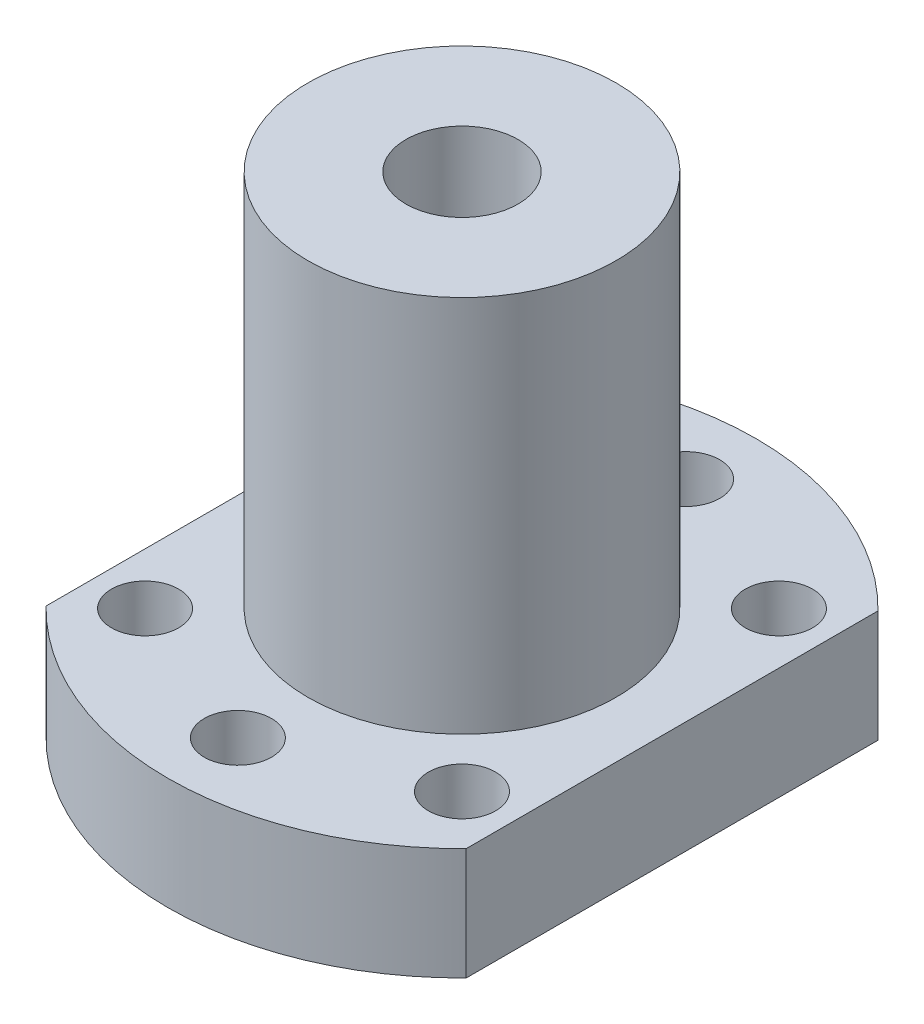
ISO-10303-21;
HEADER;
FILE_DESCRIPTION(('STEP AP214'),'2;1');
FILE_NAME('part.step','',(''),(''),'','','');
FILE_SCHEMA(('AUTOMOTIVE_DESIGN { 1 0 10303 214 1 1 1 1 }'));
ENDSEC;
DATA;
#1=APPLICATION_CONTEXT('core data for automotive mechanical design processes');
#2=APPLICATION_PROTOCOL_DEFINITION('international standard','automotive_design',2000,#1);
#3=PRODUCT_CONTEXT('',#1,'mechanical');
#4=PRODUCT('Part','Part','',(#3));
#5=PRODUCT_RELATED_PRODUCT_CATEGORY('part','',(#4));
#6=PRODUCT_DEFINITION_FORMATION('','',#4);
#7=PRODUCT_DEFINITION_CONTEXT('part definition',#1,'design');
#8=PRODUCT_DEFINITION('design','',#6,#7);
#9=PRODUCT_DEFINITION_SHAPE('','',#8);
#10=(LENGTH_UNIT() NAMED_UNIT(*) SI_UNIT(.MILLI.,.METRE.));
#11=(NAMED_UNIT(*) PLANE_ANGLE_UNIT() SI_UNIT($,.RADIAN.));
#12=(NAMED_UNIT(*) SI_UNIT($,.STERADIAN.) SOLID_ANGLE_UNIT());
#13=UNCERTAINTY_MEASURE_WITH_UNIT(LENGTH_MEASURE(1.E-05),#10,'distance_accuracy_value','');
#14=(GEOMETRIC_REPRESENTATION_CONTEXT(3) GLOBAL_UNCERTAINTY_ASSIGNED_CONTEXT((#13)) GLOBAL_UNIT_ASSIGNED_CONTEXT((#10,
#11,#12)) REPRESENTATION_CONTEXT('',''));
#15=CARTESIAN_POINT('',(0.,0.,0.));
#16=DIRECTION('',(0.,0.,1.));
#17=DIRECTION('',(1.,0.,0.));
#18=AXIS2_PLACEMENT_3D('',#15,#16,#17);
#19=CARTESIAN_POINT('',(0.,8.,0.));
#20=DIRECTION('',(0.,1.,0.));
#21=DIRECTION('',(0.,0.,1.));
#22=AXIS2_PLACEMENT_3D('',#19,#20,#21);
#23=PLANE('',#22);
#24=CARTESIAN_POINT('',(0.,8.,0.));
#25=DIRECTION('',(0.,1.,0.));
#26=DIRECTION('',(0.,0.,1.));
#27=AXIS2_PLACEMENT_3D('',#24,#25,#26);
#28=CIRCLE('',#27,21.);
#29=CARTESIAN_POINT('',(15.,8.,-14.6969384566991));
#30=VERTEX_POINT('',#29);
#31=CARTESIAN_POINT('',(-15.,8.,-14.6969384566991));
#32=VERTEX_POINT('',#31);
#33=EDGE_CURVE('E87',#30,#32,#28,.T.);
#34=ORIENTED_EDGE('',*,*,#33,.T.);
#35=DIRECTION('',(0.,0.,1.));
#36=VECTOR('',#35,1.);
#37=CARTESIAN_POINT('',(-15.,8.,-14.6969384566991));
#38=LINE('',#37,#36);
#39=CARTESIAN_POINT('',(-15.,8.,14.6969384566991));
#40=VERTEX_POINT('',#39);
#41=EDGE_CURVE('E82',#32,#40,#38,.T.);
#42=ORIENTED_EDGE('',*,*,#41,.T.);
#43=CARTESIAN_POINT('',(0.,8.,0.));
#44=DIRECTION('',(0.,1.,0.));
#45=DIRECTION('',(0.,0.,1.));
#46=AXIS2_PLACEMENT_3D('',#43,#44,#45);
#47=CIRCLE('',#46,21.);
#48=CARTESIAN_POINT('',(15.,8.,14.6969384566991));
#49=VERTEX_POINT('',#48);
#50=EDGE_CURVE('E85',#40,#49,#47,.T.);
#51=ORIENTED_EDGE('',*,*,#50,.T.);
#52=DIRECTION('',(0.,0.,-1.));
#53=VECTOR('',#52,1.);
#54=CARTESIAN_POINT('',(15.,8.,-14.6969384566991));
#55=LINE('',#54,#53);
#56=EDGE_CURVE('E52',#49,#30,#55,.T.);
#57=ORIENTED_EDGE('',*,*,#56,.T.);
#58=EDGE_LOOP('',(#34,#42,#51,#57));
#59=FACE_BOUND('',#58,.T.);
#60=CARTESIAN_POINT('',(-11.3137084989848,8.,-11.3137084989847));
#61=DIRECTION('',(0.,1.,0.));
#62=DIRECTION('',(0.,0.,1.));
#63=AXIS2_PLACEMENT_3D('',#60,#61,#62);
#64=CIRCLE('',#63,2.4);
#65=CARTESIAN_POINT('',(-11.3137084989848,8.,-8.9137084989847));
#66=VERTEX_POINT('',#65);
#67=EDGE_CURVE('E116',#66,#66,#64,.T.);
#68=ORIENTED_EDGE('',*,*,#67,.F.);
#69=EDGE_LOOP('',(#68));
#70=FACE_BOUND('',#69,.T.);
#71=CARTESIAN_POINT('',(-11.3137084989847,8.,11.3137084989849));
#72=DIRECTION('',(0.,1.,0.));
#73=DIRECTION('',(1.,0.,0.));
#74=AXIS2_PLACEMENT_3D('',#71,#72,#73);
#75=CIRCLE('',#74,2.4);
#76=CARTESIAN_POINT('',(-8.91370849898466,8.,11.3137084989848));
#77=VERTEX_POINT('',#76);
#78=EDGE_CURVE('E122',#77,#77,#75,.T.);
#79=ORIENTED_EDGE('',*,*,#78,.F.);
#80=EDGE_LOOP('',(#79));
#81=FACE_BOUND('',#80,.T.);
#82=CARTESIAN_POINT('',(1.6826817716975E-13,8.,16.));
#83=DIRECTION('',(0.,1.,0.));
#84=DIRECTION('',(0.707106781186544,0.,-0.707106781186551));
#85=AXIS2_PLACEMENT_3D('',#82,#83,#84);
#86=CIRCLE('',#85,2.4);
#87=CARTESIAN_POINT('',(1.69705627484787,8.,14.3029437251523));
#88=VERTEX_POINT('',#87);
#89=EDGE_CURVE('E128',#88,#88,#86,.T.);
#90=ORIENTED_EDGE('',*,*,#89,.F.);
#91=EDGE_LOOP('',(#90));
#92=FACE_BOUND('',#91,.T.);
#93=CARTESIAN_POINT('',(11.3137084989848,8.,11.3137084989847));
#94=DIRECTION('',(0.,1.,0.));
#95=DIRECTION('',(0.,0.,-1.));
#96=AXIS2_PLACEMENT_3D('',#93,#94,#95);
#97=CIRCLE('',#96,2.4);
#98=CARTESIAN_POINT('',(11.3137084989848,8.,8.9137084989847));
#99=VERTEX_POINT('',#98);
#100=EDGE_CURVE('E134',#99,#99,#97,.T.);
#101=ORIENTED_EDGE('',*,*,#100,.F.);
#102=EDGE_LOOP('',(#101));
#103=FACE_BOUND('',#102,.T.);
#104=CARTESIAN_POINT('',(11.3137084989846,8.,-11.3137084989849));
#105=DIRECTION('',(0.,1.,0.));
#106=DIRECTION('',(-1.,0.,0.));
#107=AXIS2_PLACEMENT_3D('',#104,#105,#106);
#108=CIRCLE('',#107,2.4);
#109=CARTESIAN_POINT('',(8.91370849898458,8.,-11.3137084989849));
#110=VERTEX_POINT('',#109);
#111=EDGE_CURVE('E140',#110,#110,#108,.T.);
#112=ORIENTED_EDGE('',*,*,#111,.F.);
#113=EDGE_LOOP('',(#112));
#114=FACE_BOUND('',#113,.T.);
#115=CARTESIAN_POINT('',(-2.79290479632266E-13,8.,-16.));
#116=DIRECTION('',(0.,1.,0.));
#117=DIRECTION('',(-0.707106781186539,0.,0.707106781186556));
#118=AXIS2_PLACEMENT_3D('',#115,#116,#117);
#119=CIRCLE('',#118,2.4);
#120=CARTESIAN_POINT('',(-1.69705627484797,8.,-14.3029437251523));
#121=VERTEX_POINT('',#120);
#122=EDGE_CURVE('E146',#121,#121,#119,.T.);
#123=ORIENTED_EDGE('',*,*,#122,.F.);
#124=EDGE_LOOP('',(#123));
#125=FACE_BOUND('',#124,.T.);
#126=CARTESIAN_POINT('',(0.,8.,0.));
#127=DIRECTION('',(0.,1.,0.));
#128=DIRECTION('',(0.,0.,1.));
#129=AXIS2_PLACEMENT_3D('',#126,#127,#128);
#130=CIRCLE('',#129,11.);
#131=CARTESIAN_POINT('',(0.,8.,11.));
#132=VERTEX_POINT('',#131);
#133=EDGE_CURVE('E152',#132,#132,#130,.T.);
#134=ORIENTED_EDGE('',*,*,#133,.F.);
#135=EDGE_LOOP('',(#134));
#136=FACE_BOUND('',#135,.T.);
#137=ADVANCED_FACE('F35',(#59,#70,#81,#92,#103,#114,#125,#136),#23,.T.);
#138=CARTESIAN_POINT('',(0.,8.,0.));
#139=DIRECTION('',(0.,-1.,0.));
#140=DIRECTION('',(0.,0.,-1.));
#141=AXIS2_PLACEMENT_3D('',#138,#139,#140);
#142=CYLINDRICAL_SURFACE('',#141,21.);
#143=CARTESIAN_POINT('',(0.,0.,0.));
#144=DIRECTION('',(0.,1.,0.));
#145=DIRECTION('',(0.,0.,1.));
#146=AXIS2_PLACEMENT_3D('',#143,#144,#145);
#147=CIRCLE('',#146,21.);
#148=CARTESIAN_POINT('',(15.,0.,-14.6969384566991));
#149=VERTEX_POINT('',#148);
#150=CARTESIAN_POINT('',(-15.,0.,-14.6969384566991));
#151=VERTEX_POINT('',#150);
#152=EDGE_CURVE('E99',#149,#151,#147,.T.);
#153=ORIENTED_EDGE('',*,*,#152,.T.);
#154=DIRECTION('',(0.,-1.,0.));
#155=VECTOR('',#154,1.);
#156=CARTESIAN_POINT('',(-15.,8.,-14.6969384566991));
#157=LINE('',#156,#155);
#158=EDGE_CURVE('E11',#32,#151,#157,.T.);
#159=ORIENTED_EDGE('',*,*,#158,.F.);
#160=ORIENTED_EDGE('',*,*,#33,.F.);
#161=DIRECTION('',(0.,-1.,0.));
#162=VECTOR('',#161,1.);
#163=CARTESIAN_POINT('',(15.,8.,-14.6969384566991));
#164=LINE('',#163,#162);
#165=EDGE_CURVE('E95',#30,#149,#164,.T.);
#166=ORIENTED_EDGE('',*,*,#165,.T.);
#167=EDGE_LOOP('',(#153,#159,#160,#166));
#168=FACE_BOUND('',#167,.T.);
#169=ADVANCED_FACE('F37',(#168),#142,.T.);
#170=CARTESIAN_POINT('',(-15.,8.,-14.6969384566991));
#171=DIRECTION('',(1.,0.,0.));
#172=DIRECTION('',(0.,0.,-1.));
#173=AXIS2_PLACEMENT_3D('',#170,#171,#172);
#174=PLANE('',#173);
#175=DIRECTION('',(0.,0.,1.));
#176=VECTOR('',#175,1.);
#177=CARTESIAN_POINT('',(-15.,0.,-14.6969384566991));
#178=LINE('',#177,#176);
#179=CARTESIAN_POINT('',(-15.,0.,14.6969384566991));
#180=VERTEX_POINT('',#179);
#181=EDGE_CURVE('E91',#151,#180,#178,.T.);
#182=ORIENTED_EDGE('',*,*,#181,.T.);
#183=DIRECTION('',(0.,-1.,0.));
#184=VECTOR('',#183,1.);
#185=CARTESIAN_POINT('',(-15.,8.,14.6969384566991));
#186=LINE('',#185,#184);
#187=EDGE_CURVE('E44',#40,#180,#186,.T.);
#188=ORIENTED_EDGE('',*,*,#187,.F.);
#189=ORIENTED_EDGE('',*,*,#41,.F.);
#190=ORIENTED_EDGE('',*,*,#158,.T.);
#191=EDGE_LOOP('',(#182,#188,#189,#190));
#192=FACE_BOUND('',#191,.T.);
#193=ADVANCED_FACE('F90',(#192),#174,.F.);
#194=CARTESIAN_POINT('',(0.,8.,0.));
#195=DIRECTION('',(0.,-1.,0.));
#196=DIRECTION('',(0.,0.,-1.));
#197=AXIS2_PLACEMENT_3D('',#194,#195,#196);
#198=CYLINDRICAL_SURFACE('',#197,21.);
#199=CARTESIAN_POINT('',(0.,0.,0.));
#200=DIRECTION('',(0.,1.,0.));
#201=DIRECTION('',(0.,0.,1.));
#202=AXIS2_PLACEMENT_3D('',#199,#200,#201);
#203=CIRCLE('',#202,21.);
#204=CARTESIAN_POINT('',(15.,0.,14.6969384566991));
#205=VERTEX_POINT('',#204);
#206=EDGE_CURVE('E69',#180,#205,#203,.T.);
#207=ORIENTED_EDGE('',*,*,#206,.T.);
#208=DIRECTION('',(0.,-1.,0.));
#209=VECTOR('',#208,1.);
#210=CARTESIAN_POINT('',(15.,8.,14.6969384566991));
#211=LINE('',#210,#209);
#212=EDGE_CURVE('E92',#49,#205,#211,.T.);
#213=ORIENTED_EDGE('',*,*,#212,.F.);
#214=ORIENTED_EDGE('',*,*,#50,.F.);
#215=ORIENTED_EDGE('',*,*,#187,.T.);
#216=EDGE_LOOP('',(#207,#213,#214,#215));
#217=FACE_BOUND('',#216,.T.);
#218=ADVANCED_FACE('F93',(#217),#198,.T.);
#219=CARTESIAN_POINT('',(15.,8.,-14.6969384566991));
#220=DIRECTION('',(-1.,0.,0.));
#221=DIRECTION('',(0.,0.,1.));
#222=AXIS2_PLACEMENT_3D('',#219,#220,#221);
#223=PLANE('',#222);
#224=DIRECTION('',(0.,0.,-1.));
#225=VECTOR('',#224,1.);
#226=CARTESIAN_POINT('',(15.,0.,-14.6969384566991));
#227=LINE('',#226,#225);
#228=EDGE_CURVE('E75',#205,#149,#227,.T.);
#229=ORIENTED_EDGE('',*,*,#228,.T.);
#230=ORIENTED_EDGE('',*,*,#165,.F.);
#231=ORIENTED_EDGE('',*,*,#56,.F.);
#232=ORIENTED_EDGE('',*,*,#212,.T.);
#233=EDGE_LOOP('',(#229,#230,#231,#232));
#234=FACE_BOUND('',#233,.T.);
#235=ADVANCED_FACE('F107',(#234),#223,.F.);
#236=CARTESIAN_POINT('',(0.,0.,0.));
#237=DIRECTION('',(0.,1.,0.));
#238=DIRECTION('',(0.,0.,1.));
#239=AXIS2_PLACEMENT_3D('',#236,#237,#238);
#240=PLANE('',#239);
#241=CARTESIAN_POINT('',(-2.79290479632266E-13,0.,-16.));
#242=DIRECTION('',(0.,1.,0.));
#243=DIRECTION('',(-0.707106781186539,0.,0.707106781186556));
#244=AXIS2_PLACEMENT_3D('',#241,#242,#243);
#245=CIRCLE('',#244,2.4);
#246=CARTESIAN_POINT('',(-1.69705627484797,0.,-14.3029437251523));
#247=VERTEX_POINT('',#246);
#248=EDGE_CURVE('E143',#247,#247,#245,.T.);
#249=ORIENTED_EDGE('',*,*,#248,.T.);
#250=EDGE_LOOP('',(#249));
#251=FACE_BOUND('',#250,.T.);
#252=CARTESIAN_POINT('',(11.3137084989846,0.,-11.3137084989849));
#253=DIRECTION('',(0.,1.,0.));
#254=DIRECTION('',(-1.,0.,0.));
#255=AXIS2_PLACEMENT_3D('',#252,#253,#254);
#256=CIRCLE('',#255,2.4);
#257=CARTESIAN_POINT('',(8.91370849898458,0.,-11.3137084989849));
#258=VERTEX_POINT('',#257);
#259=EDGE_CURVE('E137',#258,#258,#256,.T.);
#260=ORIENTED_EDGE('',*,*,#259,.T.);
#261=EDGE_LOOP('',(#260));
#262=FACE_BOUND('',#261,.T.);
#263=CARTESIAN_POINT('',(11.3137084989848,0.,11.3137084989847));
#264=DIRECTION('',(0.,1.,0.));
#265=DIRECTION('',(0.,0.,-1.));
#266=AXIS2_PLACEMENT_3D('',#263,#264,#265);
#267=CIRCLE('',#266,2.4);
#268=CARTESIAN_POINT('',(11.3137084989848,0.,8.9137084989847));
#269=VERTEX_POINT('',#268);
#270=EDGE_CURVE('E131',#269,#269,#267,.T.);
#271=ORIENTED_EDGE('',*,*,#270,.T.);
#272=EDGE_LOOP('',(#271));
#273=FACE_BOUND('',#272,.T.);
#274=CARTESIAN_POINT('',(1.6826817716975E-13,0.,16.));
#275=DIRECTION('',(0.,1.,0.));
#276=DIRECTION('',(0.707106781186544,0.,-0.707106781186551));
#277=AXIS2_PLACEMENT_3D('',#274,#275,#276);
#278=CIRCLE('',#277,2.4);
#279=CARTESIAN_POINT('',(1.69705627484787,0.,14.3029437251523));
#280=VERTEX_POINT('',#279);
#281=EDGE_CURVE('E125',#280,#280,#278,.T.);
#282=ORIENTED_EDGE('',*,*,#281,.T.);
#283=EDGE_LOOP('',(#282));
#284=FACE_BOUND('',#283,.T.);
#285=CARTESIAN_POINT('',(-11.3137084989847,0.,11.3137084989849));
#286=DIRECTION('',(0.,1.,0.));
#287=DIRECTION('',(1.,0.,0.));
#288=AXIS2_PLACEMENT_3D('',#285,#286,#287);
#289=CIRCLE('',#288,2.4);
#290=CARTESIAN_POINT('',(-8.91370849898466,0.,11.3137084989848));
#291=VERTEX_POINT('',#290);
#292=EDGE_CURVE('E119',#291,#291,#289,.T.);
#293=ORIENTED_EDGE('',*,*,#292,.T.);
#294=EDGE_LOOP('',(#293));
#295=FACE_BOUND('',#294,.T.);
#296=CARTESIAN_POINT('',(-11.3137084989848,0.,-11.3137084989847));
#297=DIRECTION('',(0.,1.,0.));
#298=DIRECTION('',(0.,0.,1.));
#299=AXIS2_PLACEMENT_3D('',#296,#297,#298);
#300=CIRCLE('',#299,2.4);
#301=CARTESIAN_POINT('',(-11.3137084989848,0.,-8.9137084989847));
#302=VERTEX_POINT('',#301);
#303=EDGE_CURVE('E115',#302,#302,#300,.T.);
#304=ORIENTED_EDGE('',*,*,#303,.T.);
#305=EDGE_LOOP('',(#304));
#306=FACE_BOUND('',#305,.T.);
#307=CARTESIAN_POINT('',(0.,0.,0.));
#308=DIRECTION('',(0.,1.,0.));
#309=DIRECTION('',(0.,0.,1.));
#310=AXIS2_PLACEMENT_3D('',#307,#308,#309);
#311=CIRCLE('',#310,4.);
#312=CARTESIAN_POINT('',(0.,0.,4.));
#313=VERTEX_POINT('',#312);
#314=EDGE_CURVE('E102',#313,#313,#311,.T.);
#315=ORIENTED_EDGE('',*,*,#314,.T.);
#316=EDGE_LOOP('',(#315));
#317=FACE_BOUND('',#316,.T.);
#318=ORIENTED_EDGE('',*,*,#152,.F.);
#319=ORIENTED_EDGE('',*,*,#228,.F.);
#320=ORIENTED_EDGE('',*,*,#206,.F.);
#321=ORIENTED_EDGE('',*,*,#181,.F.);
#322=EDGE_LOOP('',(#318,#319,#320,#321));
#323=FACE_BOUND('',#322,.T.);
#324=ADVANCED_FACE('F110',(#251,#262,#273,#284,#295,#306,#317,#323),#240,.F.);
#325=CARTESIAN_POINT('',(0.,0.,0.));
#326=DIRECTION('',(0.,1.,0.));
#327=DIRECTION('',(0.,0.,1.));
#328=AXIS2_PLACEMENT_3D('',#325,#326,#327);
#329=CYLINDRICAL_SURFACE('',#328,4.);
#330=ORIENTED_EDGE('',*,*,#314,.F.);
#331=EDGE_LOOP('',(#330));
#332=FACE_BOUND('',#331,.T.);
#333=CARTESIAN_POINT('',(0.,35.,0.));
#334=DIRECTION('',(0.,1.,0.));
#335=DIRECTION('',(0.,0.,1.));
#336=AXIS2_PLACEMENT_3D('',#333,#334,#335);
#337=CIRCLE('',#336,4.);
#338=CARTESIAN_POINT('',(0.,35.,4.));
#339=VERTEX_POINT('',#338);
#340=EDGE_CURVE('E155',#339,#339,#337,.T.);
#341=ORIENTED_EDGE('',*,*,#340,.T.);
#342=EDGE_LOOP('',(#341));
#343=FACE_BOUND('',#342,.T.);
#344=ADVANCED_FACE('F161',(#332,#343),#329,.F.);
#345=CARTESIAN_POINT('',(-11.3137084989848,0.,-11.3137084989847));
#346=DIRECTION('',(0.,1.,0.));
#347=DIRECTION('',(0.,0.,1.));
#348=AXIS2_PLACEMENT_3D('',#345,#346,#347);
#349=CYLINDRICAL_SURFACE('',#348,2.4);
#350=ORIENTED_EDGE('',*,*,#303,.F.);
#351=EDGE_LOOP('',(#350));
#352=FACE_BOUND('',#351,.T.);
#353=ORIENTED_EDGE('',*,*,#67,.T.);
#354=EDGE_LOOP('',(#353));
#355=FACE_BOUND('',#354,.T.);
#356=ADVANCED_FACE('F215',(#352,#355),#349,.F.);
#357=CARTESIAN_POINT('',(-11.3137084989847,0.,11.3137084989849));
#358=DIRECTION('',(0.,1.,0.));
#359=DIRECTION('',(0.,0.,1.));
#360=AXIS2_PLACEMENT_3D('',#357,#358,#359);
#361=CYLINDRICAL_SURFACE('',#360,2.4);
#362=ORIENTED_EDGE('',*,*,#292,.F.);
#363=EDGE_LOOP('',(#362));
#364=FACE_BOUND('',#363,.T.);
#365=ORIENTED_EDGE('',*,*,#78,.T.);
#366=EDGE_LOOP('',(#365));
#367=FACE_BOUND('',#366,.T.);
#368=ADVANCED_FACE('F223',(#364,#367),#361,.F.);
#369=CARTESIAN_POINT('',(1.6826817716975E-13,0.,16.));
#370=DIRECTION('',(0.,1.,0.));
#371=DIRECTION('',(0.,0.,1.));
#372=AXIS2_PLACEMENT_3D('',#369,#370,#371);
#373=CYLINDRICAL_SURFACE('',#372,2.4);
#374=ORIENTED_EDGE('',*,*,#281,.F.);
#375=EDGE_LOOP('',(#374));
#376=FACE_BOUND('',#375,.T.);
#377=ORIENTED_EDGE('',*,*,#89,.T.);
#378=EDGE_LOOP('',(#377));
#379=FACE_BOUND('',#378,.T.);
#380=ADVANCED_FACE('F229',(#376,#379),#373,.F.);
#381=CARTESIAN_POINT('',(11.3137084989848,0.,11.3137084989847));
#382=DIRECTION('',(0.,1.,0.));
#383=DIRECTION('',(0.,0.,1.));
#384=AXIS2_PLACEMENT_3D('',#381,#382,#383);
#385=CYLINDRICAL_SURFACE('',#384,2.4);
#386=ORIENTED_EDGE('',*,*,#270,.F.);
#387=EDGE_LOOP('',(#386));
#388=FACE_BOUND('',#387,.T.);
#389=ORIENTED_EDGE('',*,*,#100,.T.);
#390=EDGE_LOOP('',(#389));
#391=FACE_BOUND('',#390,.T.);
#392=ADVANCED_FACE('F237',(#388,#391),#385,.F.);
#393=CARTESIAN_POINT('',(11.3137084989846,0.,-11.3137084989849));
#394=DIRECTION('',(0.,1.,0.));
#395=DIRECTION('',(0.,0.,1.));
#396=AXIS2_PLACEMENT_3D('',#393,#394,#395);
#397=CYLINDRICAL_SURFACE('',#396,2.4);
#398=ORIENTED_EDGE('',*,*,#259,.F.);
#399=EDGE_LOOP('',(#398));
#400=FACE_BOUND('',#399,.T.);
#401=ORIENTED_EDGE('',*,*,#111,.T.);
#402=EDGE_LOOP('',(#401));
#403=FACE_BOUND('',#402,.T.);
#404=ADVANCED_FACE('F245',(#400,#403),#397,.F.);
#405=CARTESIAN_POINT('',(-2.79290479632266E-13,0.,-16.));
#406=DIRECTION('',(0.,1.,0.));
#407=DIRECTION('',(0.,0.,1.));
#408=AXIS2_PLACEMENT_3D('',#405,#406,#407);
#409=CYLINDRICAL_SURFACE('',#408,2.4);
#410=ORIENTED_EDGE('',*,*,#248,.F.);
#411=EDGE_LOOP('',(#410));
#412=FACE_BOUND('',#411,.T.);
#413=ORIENTED_EDGE('',*,*,#122,.T.);
#414=EDGE_LOOP('',(#413));
#415=FACE_BOUND('',#414,.T.);
#416=ADVANCED_FACE('F172',(#412,#415),#409,.F.);
#417=CARTESIAN_POINT('',(0.,35.,0.));
#418=DIRECTION('',(0.,-1.,0.));
#419=DIRECTION('',(0.,0.,-1.));
#420=AXIS2_PLACEMENT_3D('',#417,#418,#419);
#421=CYLINDRICAL_SURFACE('',#420,11.);
#422=CARTESIAN_POINT('',(0.,35.,0.));
#423=DIRECTION('',(0.,1.,0.));
#424=DIRECTION('',(0.,0.,1.));
#425=AXIS2_PLACEMENT_3D('',#422,#423,#424);
#426=CIRCLE('',#425,11.);
#427=CARTESIAN_POINT('',(0.,35.,11.));
#428=VERTEX_POINT('',#427);
#429=EDGE_CURVE('E149',#428,#428,#426,.T.);
#430=ORIENTED_EDGE('',*,*,#429,.F.);
#431=EDGE_LOOP('',(#430));
#432=FACE_BOUND('',#431,.T.);
#433=ORIENTED_EDGE('',*,*,#133,.T.);
#434=EDGE_LOOP('',(#433));
#435=FACE_BOUND('',#434,.T.);
#436=ADVANCED_FACE('F166',(#432,#435),#421,.T.);
#437=CARTESIAN_POINT('',(0.,35.,0.));
#438=DIRECTION('',(0.,1.,0.));
#439=DIRECTION('',(0.,0.,1.));
#440=AXIS2_PLACEMENT_3D('',#437,#438,#439);
#441=PLANE('',#440);
#442=ORIENTED_EDGE('',*,*,#340,.F.);
#443=EDGE_LOOP('',(#442));
#444=FACE_BOUND('',#443,.T.);
#445=ORIENTED_EDGE('',*,*,#429,.T.);
#446=EDGE_LOOP('',(#445));
#447=FACE_BOUND('',#446,.T.);
#448=ADVANCED_FACE('F163',(#444,#447),#441,.T.);
#449=CLOSED_SHELL('',(#137,#169,#193,#218,#235,#324,#344,#356,#368,#380,#392,#404,#416,#436,#448));
#450=MANIFOLD_SOLID_BREP('B2',#449);
#451=ADVANCED_BREP_SHAPE_REPRESENTATION('',(#18,#450),#14);
#452=SHAPE_DEFINITION_REPRESENTATION(#9,#451);
ENDSEC;
END-ISO-10303-21;
